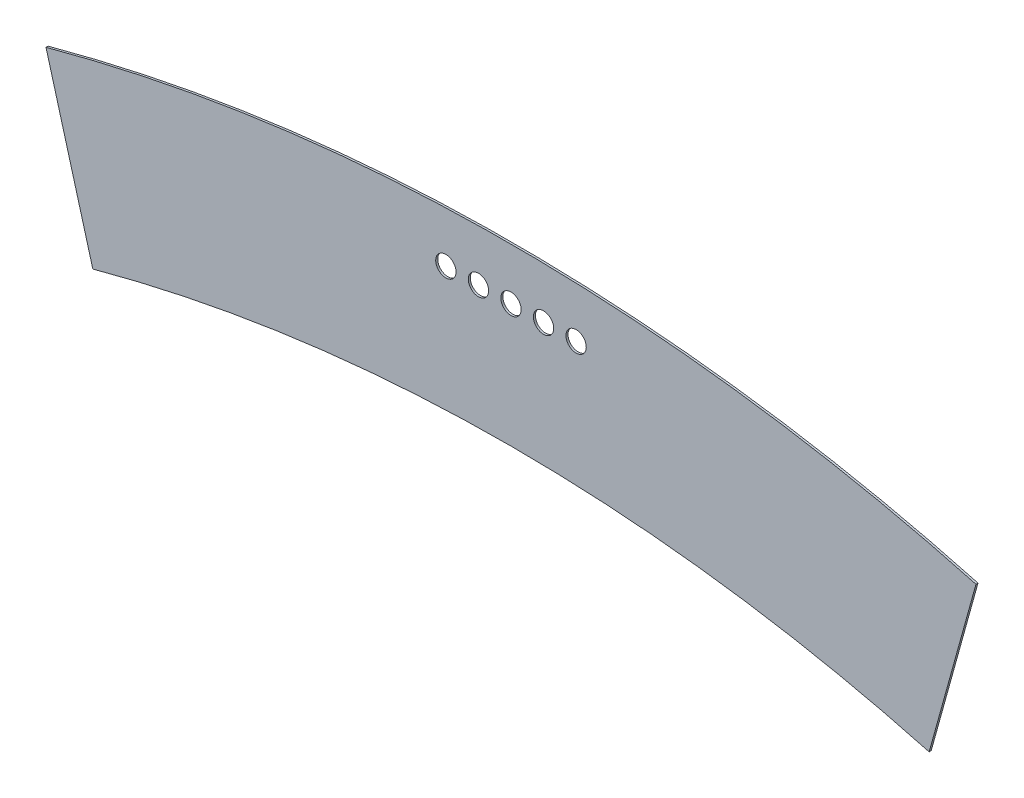
ISO-10303-21;
HEADER;
FILE_DESCRIPTION(('STEP AP214'),'2;1');
FILE_NAME('part.step','',(''),(''),'','','');
FILE_SCHEMA(('AUTOMOTIVE_DESIGN { 1 0 10303 214 1 1 1 1 }'));
ENDSEC;
DATA;
#1=APPLICATION_CONTEXT('core data for automotive mechanical design processes');
#2=APPLICATION_PROTOCOL_DEFINITION('international standard','automotive_design',2000,#1);
#3=PRODUCT_CONTEXT('',#1,'mechanical');
#4=PRODUCT('Part','Part','',(#3));
#5=PRODUCT_RELATED_PRODUCT_CATEGORY('part','',(#4));
#6=PRODUCT_DEFINITION_FORMATION('','',#4);
#7=PRODUCT_DEFINITION_CONTEXT('part definition',#1,'design');
#8=PRODUCT_DEFINITION('design','',#6,#7);
#9=PRODUCT_DEFINITION_SHAPE('','',#8);
#10=(LENGTH_UNIT() NAMED_UNIT(*) SI_UNIT(.MILLI.,.METRE.));
#11=(NAMED_UNIT(*) PLANE_ANGLE_UNIT() SI_UNIT($,.RADIAN.));
#12=(NAMED_UNIT(*) SI_UNIT($,.STERADIAN.) SOLID_ANGLE_UNIT());
#13=UNCERTAINTY_MEASURE_WITH_UNIT(LENGTH_MEASURE(1.E-05),#10,'distance_accuracy_value','');
#14=(GEOMETRIC_REPRESENTATION_CONTEXT(3) GLOBAL_UNCERTAINTY_ASSIGNED_CONTEXT((#13)) GLOBAL_UNIT_ASSIGNED_CONTEXT((#10,
#11,#12)) REPRESENTATION_CONTEXT('',''));
#15=CARTESIAN_POINT('',(0.,0.,0.));
#16=DIRECTION('',(0.,0.,1.));
#17=DIRECTION('',(1.,0.,0.));
#18=AXIS2_PLACEMENT_3D('',#15,#16,#17);
#19=CARTESIAN_POINT('',(8.46219338986086E-13,-2764.0534,-3.175));
#20=DIRECTION('',(0.,0.,1.));
#21=DIRECTION('',(1.,0.,0.));
#22=AXIS2_PLACEMENT_3D('',#19,#20,#21);
#23=CYLINDRICAL_SURFACE('',#22,2764.0534);
#24=CARTESIAN_POINT('',(8.46219338986086E-13,-2764.0534,0.));
#25=DIRECTION('',(0.,0.,1.));
#26=DIRECTION('',(1.,0.,0.));
#27=AXIS2_PLACEMENT_3D('',#24,#25,#26);
#28=CIRCLE('',#27,2764.0534);
#29=CARTESIAN_POINT('',(725.551,-96.926304331224,0.));
#30=VERTEX_POINT('',#29);
#31=CARTESIAN_POINT('',(-725.551,-96.9263043312241,0.));
#32=VERTEX_POINT('',#31);
#33=EDGE_CURVE('E76',#30,#32,#28,.T.);
#34=ORIENTED_EDGE('',*,*,#33,.F.);
#35=DIRECTION('',(0.,0.,1.));
#36=VECTOR('',#35,1.);
#37=CARTESIAN_POINT('',(725.551,-96.926304331224,-3.175));
#38=LINE('',#37,#36);
#39=CARTESIAN_POINT('',(725.551,-96.926304331224,-3.175));
#40=VERTEX_POINT('',#39);
#41=EDGE_CURVE('E11',#40,#30,#38,.T.);
#42=ORIENTED_EDGE('',*,*,#41,.F.);
#43=CARTESIAN_POINT('',(8.46219338986086E-13,-2764.0534,-3.175));
#44=DIRECTION('',(0.,0.,1.));
#45=DIRECTION('',(1.,0.,0.));
#46=AXIS2_PLACEMENT_3D('',#43,#44,#45);
#47=CIRCLE('',#46,2764.0534);
#48=CARTESIAN_POINT('',(-725.551,-96.9263043312241,-3.175));
#49=VERTEX_POINT('',#48);
#50=EDGE_CURVE('E78',#40,#49,#47,.T.);
#51=ORIENTED_EDGE('',*,*,#50,.T.);
#52=DIRECTION('',(0.,0.,1.));
#53=VECTOR('',#52,1.);
#54=CARTESIAN_POINT('',(-725.551,-96.9263043312241,-3.175));
#55=LINE('',#54,#53);
#56=EDGE_CURVE('E39',#49,#32,#55,.T.);
#57=ORIENTED_EDGE('',*,*,#56,.T.);
#58=EDGE_LOOP('',(#34,#42,#51,#57));
#59=FACE_BOUND('',#58,.T.);
#60=ADVANCED_FACE('F36',(#59),#23,.T.);
#61=CARTESIAN_POINT('',(725.551,-96.926304331224,-3.175));
#62=DIRECTION('',(0.963549299176438,-0.267530835711692,0.));
#63=DIRECTION('',(0.267530835711692,0.963549299176438,0.));
#64=AXIS2_PLACEMENT_3D('',#61,#62,#63);
#65=PLANE('',#64);
#66=DIRECTION('',(0.267530835711692,0.963549299176438,0.));
#67=VECTOR('',#66,1.);
#68=CARTESIAN_POINT('',(725.551,-96.926304331224,0.));
#69=LINE('',#68,#67);
#70=CARTESIAN_POINT('',(652.5006,-360.027421394278,0.));
#71=VERTEX_POINT('',#70);
#72=EDGE_CURVE('E93',#71,#30,#69,.T.);
#73=ORIENTED_EDGE('',*,*,#72,.F.);
#74=DIRECTION('',(0.,0.,1.));
#75=VECTOR('',#74,1.);
#76=CARTESIAN_POINT('',(652.5006,-360.027421394278,-3.175));
#77=LINE('',#76,#75);
#78=CARTESIAN_POINT('',(652.5006,-360.027421394278,-3.175));
#79=VERTEX_POINT('',#78);
#80=EDGE_CURVE('E44',#79,#71,#77,.T.);
#81=ORIENTED_EDGE('',*,*,#80,.F.);
#82=DIRECTION('',(0.267530835711692,0.963549299176438,0.));
#83=VECTOR('',#82,1.);
#84=CARTESIAN_POINT('',(725.551,-96.926304331224,-3.175));
#85=LINE('',#84,#83);
#86=EDGE_CURVE('E83',#79,#40,#85,.T.);
#87=ORIENTED_EDGE('',*,*,#86,.T.);
#88=ORIENTED_EDGE('',*,*,#41,.T.);
#89=EDGE_LOOP('',(#73,#81,#87,#88));
#90=FACE_BOUND('',#89,.T.);
#91=ADVANCED_FACE('F113',(#90),#65,.T.);
#92=CARTESIAN_POINT('',(8.46219338986086E-13,-2764.0534,-3.175));
#93=DIRECTION('',(0.,0.,1.));
#94=DIRECTION('',(1.,0.,0.));
#95=AXIS2_PLACEMENT_3D('',#92,#93,#94);
#96=CYLINDRICAL_SURFACE('',#95,2491.0034);
#97=CARTESIAN_POINT('',(8.46219338986086E-13,-2764.0534,0.));
#98=DIRECTION('',(0.,0.,-1.));
#99=DIRECTION('',(1.,0.,0.));
#100=AXIS2_PLACEMENT_3D('',#97,#98,#99);
#101=CIRCLE('',#100,2491.0034);
#102=CARTESIAN_POINT('',(-652.5006,-360.027421394279,0.));
#103=VERTEX_POINT('',#102);
#104=EDGE_CURVE('E90',#103,#71,#101,.T.);
#105=ORIENTED_EDGE('',*,*,#104,.F.);
#106=DIRECTION('',(0.,0.,1.));
#107=VECTOR('',#106,1.);
#108=CARTESIAN_POINT('',(-652.5006,-360.027421394279,-3.175));
#109=LINE('',#108,#107);
#110=CARTESIAN_POINT('',(-652.5006,-360.027421394279,-3.175));
#111=VERTEX_POINT('',#110);
#112=EDGE_CURVE('E82',#111,#103,#109,.T.);
#113=ORIENTED_EDGE('',*,*,#112,.F.);
#114=CARTESIAN_POINT('',(8.46219338986086E-13,-2764.0534,-3.175));
#115=DIRECTION('',(0.,0.,-1.));
#116=DIRECTION('',(1.,0.,0.));
#117=AXIS2_PLACEMENT_3D('',#114,#115,#116);
#118=CIRCLE('',#117,2491.0034);
#119=EDGE_CURVE('E106',#111,#79,#118,.T.);
#120=ORIENTED_EDGE('',*,*,#119,.T.);
#121=ORIENTED_EDGE('',*,*,#80,.T.);
#122=EDGE_LOOP('',(#105,#113,#120,#121));
#123=FACE_BOUND('',#122,.T.);
#124=ADVANCED_FACE('F110',(#123),#96,.F.);
#125=CARTESIAN_POINT('',(-725.551,-96.9263043312241,-3.175));
#126=DIRECTION('',(-0.963549299176438,-0.267530835711692,0.));
#127=DIRECTION('',(0.267530835711692,-0.963549299176438,0.));
#128=AXIS2_PLACEMENT_3D('',#125,#126,#127);
#129=PLANE('',#128);
#130=DIRECTION('',(0.267530835711692,-0.963549299176438,0.));
#131=VECTOR('',#130,1.);
#132=CARTESIAN_POINT('',(-725.551,-96.9263043312241,0.));
#133=LINE('',#132,#131);
#134=EDGE_CURVE('E85',#32,#103,#133,.T.);
#135=ORIENTED_EDGE('',*,*,#134,.F.);
#136=ORIENTED_EDGE('',*,*,#56,.F.);
#137=DIRECTION('',(0.267530835711692,-0.963549299176438,0.));
#138=VECTOR('',#137,1.);
#139=CARTESIAN_POINT('',(-725.551,-96.9263043312241,-3.175));
#140=LINE('',#139,#138);
#141=EDGE_CURVE('E104',#49,#111,#140,.T.);
#142=ORIENTED_EDGE('',*,*,#141,.T.);
#143=ORIENTED_EDGE('',*,*,#112,.T.);
#144=EDGE_LOOP('',(#135,#136,#142,#143));
#145=FACE_BOUND('',#144,.T.);
#146=ADVANCED_FACE('F86',(#145),#129,.T.);
#147=CARTESIAN_POINT('',(8.46219338986086E-13,-2764.0534,-3.175));
#148=DIRECTION('',(0.,0.,1.));
#149=DIRECTION('',(1.,0.,0.));
#150=AXIS2_PLACEMENT_3D('',#147,#148,#149);
#151=PLANE('',#150);
#152=CARTESIAN_POINT('',(101.6,-80.7212,-3.175));
#153=DIRECTION('',(0.,0.,1.));
#154=DIRECTION('',(1.,0.,0.));
#155=AXIS2_PLACEMENT_3D('',#152,#153,#154);
#156=CIRCLE('',#155,15.875);
#157=CARTESIAN_POINT('',(117.475,-80.7212,-3.175));
#158=VERTEX_POINT('',#157);
#159=EDGE_CURVE('E208',#158,#158,#156,.T.);
#160=ORIENTED_EDGE('',*,*,#159,.T.);
#161=EDGE_LOOP('',(#160));
#162=FACE_BOUND('',#161,.T.);
#163=CARTESIAN_POINT('',(50.8,-80.7212,-3.175));
#164=DIRECTION('',(0.,0.,1.));
#165=DIRECTION('',(1.,0.,0.));
#166=AXIS2_PLACEMENT_3D('',#163,#164,#165);
#167=CIRCLE('',#166,15.875);
#168=CARTESIAN_POINT('',(66.675,-80.7212,-3.175));
#169=VERTEX_POINT('',#168);
#170=EDGE_CURVE('E218',#169,#169,#167,.T.);
#171=ORIENTED_EDGE('',*,*,#170,.T.);
#172=EDGE_LOOP('',(#171));
#173=FACE_BOUND('',#172,.T.);
#174=CARTESIAN_POINT('',(-101.6,-80.7212,-3.175));
#175=DIRECTION('',(0.,0.,1.));
#176=DIRECTION('',(1.,0.,0.));
#177=AXIS2_PLACEMENT_3D('',#174,#175,#176);
#178=CIRCLE('',#177,15.875);
#179=CARTESIAN_POINT('',(-85.725,-80.7212,-3.175));
#180=VERTEX_POINT('',#179);
#181=EDGE_CURVE('E224',#180,#180,#178,.T.);
#182=ORIENTED_EDGE('',*,*,#181,.T.);
#183=EDGE_LOOP('',(#182));
#184=FACE_BOUND('',#183,.T.);
#185=CARTESIAN_POINT('',(-50.8,-80.7212,-3.175));
#186=DIRECTION('',(0.,0.,1.));
#187=DIRECTION('',(1.,0.,0.));
#188=AXIS2_PLACEMENT_3D('',#185,#186,#187);
#189=CIRCLE('',#188,15.875);
#190=CARTESIAN_POINT('',(-34.925,-80.7212,-3.175));
#191=VERTEX_POINT('',#190);
#192=EDGE_CURVE('E230',#191,#191,#189,.T.);
#193=ORIENTED_EDGE('',*,*,#192,.T.);
#194=EDGE_LOOP('',(#193));
#195=FACE_BOUND('',#194,.T.);
#196=CARTESIAN_POINT('',(0.,-80.7212,-3.175));
#197=DIRECTION('',(0.,0.,1.));
#198=DIRECTION('',(1.,0.,0.));
#199=AXIS2_PLACEMENT_3D('',#196,#197,#198);
#200=CIRCLE('',#199,15.875);
#201=CARTESIAN_POINT('',(15.875,-80.7212,-3.175));
#202=VERTEX_POINT('',#201);
#203=EDGE_CURVE('E94',#202,#202,#200,.T.);
#204=ORIENTED_EDGE('',*,*,#203,.T.);
#205=EDGE_LOOP('',(#204));
#206=FACE_BOUND('',#205,.T.);
#207=ORIENTED_EDGE('',*,*,#50,.F.);
#208=ORIENTED_EDGE('',*,*,#86,.F.);
#209=ORIENTED_EDGE('',*,*,#119,.F.);
#210=ORIENTED_EDGE('',*,*,#141,.F.);
#211=EDGE_LOOP('',(#207,#208,#209,#210));
#212=FACE_BOUND('',#211,.T.);
#213=ADVANCED_FACE('F115',(#162,#173,#184,#195,#206,#212),#151,.F.);
#214=CARTESIAN_POINT('',(8.46219338986086E-13,-2764.0534,0.));
#215=DIRECTION('',(0.,0.,1.));
#216=DIRECTION('',(1.,0.,0.));
#217=AXIS2_PLACEMENT_3D('',#214,#215,#216);
#218=PLANE('',#217);
#219=CARTESIAN_POINT('',(101.6,-80.7212,0.));
#220=DIRECTION('',(0.,0.,1.));
#221=DIRECTION('',(1.,0.,0.));
#222=AXIS2_PLACEMENT_3D('',#219,#220,#221);
#223=CIRCLE('',#222,15.875);
#224=CARTESIAN_POINT('',(117.475,-80.7212,0.));
#225=VERTEX_POINT('',#224);
#226=EDGE_CURVE('E211',#225,#225,#223,.T.);
#227=ORIENTED_EDGE('',*,*,#226,.F.);
#228=EDGE_LOOP('',(#227));
#229=FACE_BOUND('',#228,.T.);
#230=CARTESIAN_POINT('',(50.8,-80.7212,0.));
#231=DIRECTION('',(0.,0.,1.));
#232=DIRECTION('',(1.,0.,0.));
#233=AXIS2_PLACEMENT_3D('',#230,#231,#232);
#234=CIRCLE('',#233,15.875);
#235=CARTESIAN_POINT('',(66.675,-80.7212,0.));
#236=VERTEX_POINT('',#235);
#237=EDGE_CURVE('E213',#236,#236,#234,.T.);
#238=ORIENTED_EDGE('',*,*,#237,.F.);
#239=EDGE_LOOP('',(#238));
#240=FACE_BOUND('',#239,.T.);
#241=CARTESIAN_POINT('',(-101.6,-80.7212,0.));
#242=DIRECTION('',(0.,0.,1.));
#243=DIRECTION('',(1.,0.,0.));
#244=AXIS2_PLACEMENT_3D('',#241,#242,#243);
#245=CIRCLE('',#244,15.875);
#246=CARTESIAN_POINT('',(-85.725,-80.7212,0.));
#247=VERTEX_POINT('',#246);
#248=EDGE_CURVE('E221',#247,#247,#245,.T.);
#249=ORIENTED_EDGE('',*,*,#248,.F.);
#250=EDGE_LOOP('',(#249));
#251=FACE_BOUND('',#250,.T.);
#252=CARTESIAN_POINT('',(-50.8,-80.7212,0.));
#253=DIRECTION('',(0.,0.,1.));
#254=DIRECTION('',(1.,0.,0.));
#255=AXIS2_PLACEMENT_3D('',#252,#253,#254);
#256=CIRCLE('',#255,15.875);
#257=CARTESIAN_POINT('',(-34.925,-80.7212,0.));
#258=VERTEX_POINT('',#257);
#259=EDGE_CURVE('E227',#258,#258,#256,.T.);
#260=ORIENTED_EDGE('',*,*,#259,.F.);
#261=EDGE_LOOP('',(#260));
#262=FACE_BOUND('',#261,.T.);
#263=CARTESIAN_POINT('',(0.,-80.7212,0.));
#264=DIRECTION('',(0.,0.,1.));
#265=DIRECTION('',(1.,0.,0.));
#266=AXIS2_PLACEMENT_3D('',#263,#264,#265);
#267=CIRCLE('',#266,15.875);
#268=CARTESIAN_POINT('',(15.875,-80.7212,0.));
#269=VERTEX_POINT('',#268);
#270=EDGE_CURVE('E97',#269,#269,#267,.T.);
#271=ORIENTED_EDGE('',*,*,#270,.F.);
#272=EDGE_LOOP('',(#271));
#273=FACE_BOUND('',#272,.T.);
#274=ORIENTED_EDGE('',*,*,#33,.T.);
#275=ORIENTED_EDGE('',*,*,#134,.T.);
#276=ORIENTED_EDGE('',*,*,#104,.T.);
#277=ORIENTED_EDGE('',*,*,#72,.T.);
#278=EDGE_LOOP('',(#274,#275,#276,#277));
#279=FACE_BOUND('',#278,.T.);
#280=ADVANCED_FACE('F92',(#229,#240,#251,#262,#273,#279),#218,.T.);
#281=CARTESIAN_POINT('',(0.,-80.7212,-3.175));
#282=DIRECTION('',(0.,0.,1.));
#283=DIRECTION('',(1.,0.,0.));
#284=AXIS2_PLACEMENT_3D('',#281,#282,#283);
#285=CYLINDRICAL_SURFACE('',#284,15.875);
#286=ORIENTED_EDGE('',*,*,#203,.F.);
#287=EDGE_LOOP('',(#286));
#288=FACE_BOUND('',#287,.T.);
#289=ORIENTED_EDGE('',*,*,#270,.T.);
#290=EDGE_LOOP('',(#289));
#291=FACE_BOUND('',#290,.T.);
#292=ADVANCED_FACE('F123',(#288,#291),#285,.F.);
#293=CARTESIAN_POINT('',(-50.8,-80.7212,-3.175));
#294=DIRECTION('',(0.,0.,1.));
#295=DIRECTION('',(1.,0.,0.));
#296=AXIS2_PLACEMENT_3D('',#293,#294,#295);
#297=CYLINDRICAL_SURFACE('',#296,15.875);
#298=ORIENTED_EDGE('',*,*,#192,.F.);
#299=EDGE_LOOP('',(#298));
#300=FACE_BOUND('',#299,.T.);
#301=ORIENTED_EDGE('',*,*,#259,.T.);
#302=EDGE_LOOP('',(#301));
#303=FACE_BOUND('',#302,.T.);
#304=ADVANCED_FACE('F162',(#300,#303),#297,.F.);
#305=CARTESIAN_POINT('',(-101.6,-80.7212,-3.175));
#306=DIRECTION('',(0.,0.,1.));
#307=DIRECTION('',(1.,0.,0.));
#308=AXIS2_PLACEMENT_3D('',#305,#306,#307);
#309=CYLINDRICAL_SURFACE('',#308,15.875);
#310=ORIENTED_EDGE('',*,*,#181,.F.);
#311=EDGE_LOOP('',(#310));
#312=FACE_BOUND('',#311,.T.);
#313=ORIENTED_EDGE('',*,*,#248,.T.);
#314=EDGE_LOOP('',(#313));
#315=FACE_BOUND('',#314,.T.);
#316=ADVANCED_FACE('F172',(#312,#315),#309,.F.);
#317=CARTESIAN_POINT('',(50.8,-80.7212,-3.175));
#318=DIRECTION('',(0.,0.,1.));
#319=DIRECTION('',(1.,0.,0.));
#320=AXIS2_PLACEMENT_3D('',#317,#318,#319);
#321=CYLINDRICAL_SURFACE('',#320,15.875);
#322=ORIENTED_EDGE('',*,*,#170,.F.);
#323=EDGE_LOOP('',(#322));
#324=FACE_BOUND('',#323,.T.);
#325=ORIENTED_EDGE('',*,*,#237,.T.);
#326=EDGE_LOOP('',(#325));
#327=FACE_BOUND('',#326,.T.);
#328=ADVANCED_FACE('F182',(#324,#327),#321,.F.);
#329=CARTESIAN_POINT('',(101.6,-80.7212,-3.175));
#330=DIRECTION('',(0.,0.,1.));
#331=DIRECTION('',(1.,0.,0.));
#332=AXIS2_PLACEMENT_3D('',#329,#330,#331);
#333=CYLINDRICAL_SURFACE('',#332,15.875);
#334=ORIENTED_EDGE('',*,*,#159,.F.);
#335=EDGE_LOOP('',(#334));
#336=FACE_BOUND('',#335,.T.);
#337=ORIENTED_EDGE('',*,*,#226,.T.);
#338=EDGE_LOOP('',(#337));
#339=FACE_BOUND('',#338,.T.);
#340=ADVANCED_FACE('F192',(#336,#339),#333,.F.);
#341=CLOSED_SHELL('',(#60,#91,#124,#146,#213,#280,#292,#304,#316,#328,#340));
#342=MANIFOLD_SOLID_BREP('B2',#341);
#343=ADVANCED_BREP_SHAPE_REPRESENTATION('',(#18,#342),#14);
#344=SHAPE_DEFINITION_REPRESENTATION(#9,#343);
ENDSEC;
END-ISO-10303-21;
